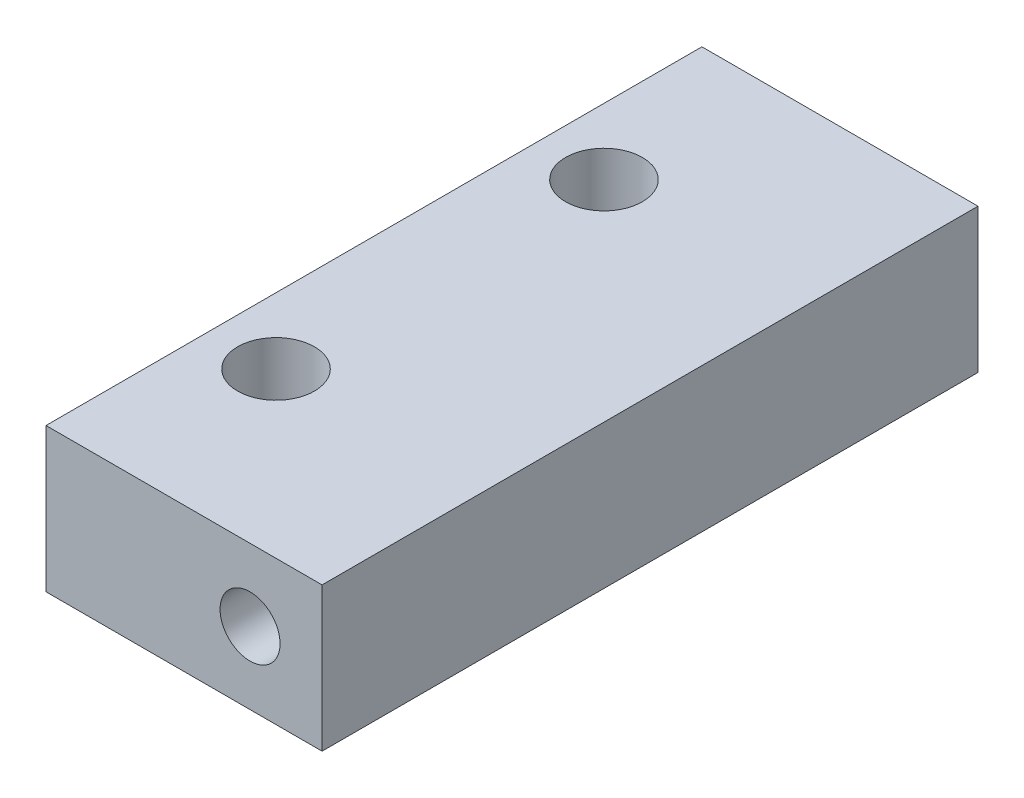
ISO-10303-21;
HEADER;
FILE_DESCRIPTION(('STEP AP214'),'2;1');
FILE_NAME('part.step','',(''),(''),'','','');
FILE_SCHEMA(('AUTOMOTIVE_DESIGN { 1 0 10303 214 1 1 1 1 }'));
ENDSEC;
DATA;
#1=APPLICATION_CONTEXT('core data for automotive mechanical design processes');
#2=APPLICATION_PROTOCOL_DEFINITION('international standard','automotive_design',2000,#1);
#3=PRODUCT_CONTEXT('',#1,'mechanical');
#4=PRODUCT('Part','Part','',(#3));
#5=PRODUCT_RELATED_PRODUCT_CATEGORY('part','',(#4));
#6=PRODUCT_DEFINITION_FORMATION('','',#4);
#7=PRODUCT_DEFINITION_CONTEXT('part definition',#1,'design');
#8=PRODUCT_DEFINITION('design','',#6,#7);
#9=PRODUCT_DEFINITION_SHAPE('','',#8);
#10=(LENGTH_UNIT() NAMED_UNIT(*) SI_UNIT(.MILLI.,.METRE.));
#11=(NAMED_UNIT(*) PLANE_ANGLE_UNIT() SI_UNIT($,.RADIAN.));
#12=(NAMED_UNIT(*) SI_UNIT($,.STERADIAN.) SOLID_ANGLE_UNIT());
#13=UNCERTAINTY_MEASURE_WITH_UNIT(LENGTH_MEASURE(1.E-05),#10,'distance_accuracy_value','');
#14=(GEOMETRIC_REPRESENTATION_CONTEXT(3) GLOBAL_UNCERTAINTY_ASSIGNED_CONTEXT((#13)) GLOBAL_UNIT_ASSIGNED_CONTEXT((#10,
#11,#12)) REPRESENTATION_CONTEXT('',''));
#15=CARTESIAN_POINT('',(0.,0.,0.));
#16=DIRECTION('',(0.,0.,1.));
#17=DIRECTION('',(1.,0.,0.));
#18=AXIS2_PLACEMENT_3D('',#15,#16,#17);
#19=CARTESIAN_POINT('',(0.,6.,0.));
#20=DIRECTION('',(-1.,0.,0.));
#21=DIRECTION('',(0.,0.,1.));
#22=AXIS2_PLACEMENT_3D('',#19,#20,#21);
#23=PLANE('',#22);
#24=DIRECTION('',(0.,0.,-1.));
#25=VECTOR('',#24,1.);
#26=CARTESIAN_POINT('',(0.,0.,0.));
#27=LINE('',#26,#25);
#28=CARTESIAN_POINT('',(0.,0.,0.));
#29=VERTEX_POINT('',#28);
#30=CARTESIAN_POINT('',(0.,0.,-27.323));
#31=VERTEX_POINT('',#30);
#32=EDGE_CURVE('E102',#29,#31,#27,.T.);
#33=ORIENTED_EDGE('',*,*,#32,.F.);
#34=DIRECTION('',(0.,-1.,0.));
#35=VECTOR('',#34,1.);
#36=CARTESIAN_POINT('',(0.,6.,0.));
#37=LINE('',#36,#35);
#38=CARTESIAN_POINT('',(0.,6.,0.));
#39=VERTEX_POINT('',#38);
#40=EDGE_CURVE('E11',#39,#29,#37,.T.);
#41=ORIENTED_EDGE('',*,*,#40,.F.);
#42=DIRECTION('',(0.,0.,-1.));
#43=VECTOR('',#42,1.);
#44=CARTESIAN_POINT('',(0.,6.,0.));
#45=LINE('',#44,#43);
#46=CARTESIAN_POINT('',(0.,6.,-27.323));
#47=VERTEX_POINT('',#46);
#48=EDGE_CURVE('E81',#39,#47,#45,.T.);
#49=ORIENTED_EDGE('',*,*,#48,.T.);
#50=DIRECTION('',(0.,-1.,0.));
#51=VECTOR('',#50,1.);
#52=CARTESIAN_POINT('',(0.,6.,-27.323));
#53=LINE('',#52,#51);
#54=EDGE_CURVE('E48',#47,#31,#53,.T.);
#55=ORIENTED_EDGE('',*,*,#54,.T.);
#56=EDGE_LOOP('',(#33,#41,#49,#55));
#57=FACE_BOUND('',#56,.T.);
#58=ADVANCED_FACE('F32',(#57),#23,.T.);
#59=CARTESIAN_POINT('',(0.,6.,0.));
#60=DIRECTION('',(0.,0.,-1.));
#61=DIRECTION('',(-1.,0.,0.));
#62=AXIS2_PLACEMENT_3D('',#59,#60,#61);
#63=PLANE('',#62);
#64=CARTESIAN_POINT('',(8.5,3.,0.));
#65=DIRECTION('',(0.,0.,1.));
#66=DIRECTION('',(1.,0.,0.));
#67=AXIS2_PLACEMENT_3D('',#64,#65,#66);
#68=CIRCLE('',#67,1.25);
#69=CARTESIAN_POINT('',(9.75,3.,0.));
#70=VERTEX_POINT('',#69);
#71=EDGE_CURVE('E121',#70,#70,#68,.T.);
#72=ORIENTED_EDGE('',*,*,#71,.F.);
#73=EDGE_LOOP('',(#72));
#74=FACE_BOUND('',#73,.T.);
#75=DIRECTION('',(1.,0.,0.));
#76=VECTOR('',#75,1.);
#77=CARTESIAN_POINT('',(0.,0.,0.));
#78=LINE('',#77,#76);
#79=CARTESIAN_POINT('',(11.5,0.,0.));
#80=VERTEX_POINT('',#79);
#81=EDGE_CURVE('E87',#29,#80,#78,.T.);
#82=ORIENTED_EDGE('',*,*,#81,.T.);
#83=DIRECTION('',(0.,-1.,0.));
#84=VECTOR('',#83,1.);
#85=CARTESIAN_POINT('',(11.5,6.,0.));
#86=LINE('',#85,#84);
#87=CARTESIAN_POINT('',(11.5,6.,0.));
#88=VERTEX_POINT('',#87);
#89=EDGE_CURVE('E40',#88,#80,#86,.T.);
#90=ORIENTED_EDGE('',*,*,#89,.F.);
#91=DIRECTION('',(1.,0.,0.));
#92=VECTOR('',#91,1.);
#93=CARTESIAN_POINT('',(0.,6.,0.));
#94=LINE('',#93,#92);
#95=EDGE_CURVE('E74',#39,#88,#94,.T.);
#96=ORIENTED_EDGE('',*,*,#95,.F.);
#97=ORIENTED_EDGE('',*,*,#40,.T.);
#98=EDGE_LOOP('',(#82,#90,#96,#97));
#99=FACE_BOUND('',#98,.T.);
#100=ADVANCED_FACE('F85',(#74,#99),#63,.F.);
#101=CARTESIAN_POINT('',(11.5,6.,0.));
#102=DIRECTION('',(-1.,0.,0.));
#103=DIRECTION('',(0.,0.,1.));
#104=AXIS2_PLACEMENT_3D('',#101,#102,#103);
#105=PLANE('',#104);
#106=DIRECTION('',(0.,0.,-1.));
#107=VECTOR('',#106,1.);
#108=CARTESIAN_POINT('',(11.5,0.,0.));
#109=LINE('',#108,#107);
#110=CARTESIAN_POINT('',(11.5,0.,-27.323));
#111=VERTEX_POINT('',#110);
#112=EDGE_CURVE('E106',#80,#111,#109,.T.);
#113=ORIENTED_EDGE('',*,*,#112,.T.);
#114=DIRECTION('',(0.,-1.,0.));
#115=VECTOR('',#114,1.);
#116=CARTESIAN_POINT('',(11.5,6.,-27.323));
#117=LINE('',#116,#115);
#118=CARTESIAN_POINT('',(11.5,6.,-27.323));
#119=VERTEX_POINT('',#118);
#120=EDGE_CURVE('E62',#119,#111,#117,.T.);
#121=ORIENTED_EDGE('',*,*,#120,.F.);
#122=DIRECTION('',(0.,0.,-1.));
#123=VECTOR('',#122,1.);
#124=CARTESIAN_POINT('',(11.5,6.,0.));
#125=LINE('',#124,#123);
#126=EDGE_CURVE('E80',#88,#119,#125,.T.);
#127=ORIENTED_EDGE('',*,*,#126,.F.);
#128=ORIENTED_EDGE('',*,*,#89,.T.);
#129=EDGE_LOOP('',(#113,#121,#127,#128));
#130=FACE_BOUND('',#129,.T.);
#131=ADVANCED_FACE('F90',(#130),#105,.F.);
#132=CARTESIAN_POINT('',(2.75,6.,-20.492));
#133=DIRECTION('',(0.,-1.,0.));
#134=DIRECTION('',(0.,0.,-1.));
#135=AXIS2_PLACEMENT_3D('',#132,#133,#134);
#136=CYLINDRICAL_SURFACE('',#135,1.6);
#137=CARTESIAN_POINT('',(2.75,6.,-20.492));
#138=DIRECTION('',(0.,1.,0.));
#139=DIRECTION('',(0.,0.,1.));
#140=AXIS2_PLACEMENT_3D('',#137,#138,#139);
#141=CIRCLE('',#140,1.6);
#142=CARTESIAN_POINT('',(2.75,6.,-18.892));
#143=VERTEX_POINT('',#142);
#144=EDGE_CURVE('E93',#143,#143,#141,.T.);
#145=ORIENTED_EDGE('',*,*,#144,.T.);
#146=EDGE_LOOP('',(#145));
#147=FACE_BOUND('',#146,.T.);
#148=CARTESIAN_POINT('',(2.75,0.,-20.492));
#149=DIRECTION('',(0.,1.,0.));
#150=DIRECTION('',(0.,0.,1.));
#151=AXIS2_PLACEMENT_3D('',#148,#149,#150);
#152=CIRCLE('',#151,1.6);
#153=CARTESIAN_POINT('',(2.75,0.,-18.892));
#154=VERTEX_POINT('',#153);
#155=EDGE_CURVE('E111',#154,#154,#152,.T.);
#156=ORIENTED_EDGE('',*,*,#155,.F.);
#157=EDGE_LOOP('',(#156));
#158=FACE_BOUND('',#157,.T.);
#159=ADVANCED_FACE('F141',(#147,#158),#136,.F.);
#160=CARTESIAN_POINT('',(0.,6.,-27.323));
#161=DIRECTION('',(0.,0.,-1.));
#162=DIRECTION('',(-1.,0.,0.));
#163=AXIS2_PLACEMENT_3D('',#160,#161,#162);
#164=PLANE('',#163);
#165=CARTESIAN_POINT('',(8.5,3.,-27.323));
#166=DIRECTION('',(0.,0.,1.));
#167=DIRECTION('',(1.,0.,0.));
#168=AXIS2_PLACEMENT_3D('',#165,#166,#167);
#169=CIRCLE('',#168,1.25);
#170=CARTESIAN_POINT('',(9.75,3.,-27.323));
#171=VERTEX_POINT('',#170);
#172=EDGE_CURVE('E104',#171,#171,#169,.T.);
#173=ORIENTED_EDGE('',*,*,#172,.T.);
#174=EDGE_LOOP('',(#173));
#175=FACE_BOUND('',#174,.T.);
#176=DIRECTION('',(1.,0.,0.));
#177=VECTOR('',#176,1.);
#178=CARTESIAN_POINT('',(0.,0.,-27.323));
#179=LINE('',#178,#177);
#180=EDGE_CURVE('E108',#31,#111,#179,.T.);
#181=ORIENTED_EDGE('',*,*,#180,.F.);
#182=ORIENTED_EDGE('',*,*,#54,.F.);
#183=DIRECTION('',(1.,0.,0.));
#184=VECTOR('',#183,1.);
#185=CARTESIAN_POINT('',(0.,6.,-27.323));
#186=LINE('',#185,#184);
#187=EDGE_CURVE('E91',#47,#119,#186,.T.);
#188=ORIENTED_EDGE('',*,*,#187,.T.);
#189=ORIENTED_EDGE('',*,*,#120,.T.);
#190=EDGE_LOOP('',(#181,#182,#188,#189));
#191=FACE_BOUND('',#190,.T.);
#192=ADVANCED_FACE('F127',(#175,#191),#164,.T.);
#193=CARTESIAN_POINT('',(2.75,6.,-6.831));
#194=DIRECTION('',(0.,-1.,0.));
#195=DIRECTION('',(0.,0.,-1.));
#196=AXIS2_PLACEMENT_3D('',#193,#194,#195);
#197=CYLINDRICAL_SURFACE('',#196,1.6);
#198=CARTESIAN_POINT('',(2.75,6.,-6.831));
#199=DIRECTION('',(0.,1.,0.));
#200=DIRECTION('',(0.,0.,1.));
#201=AXIS2_PLACEMENT_3D('',#198,#199,#200);
#202=CIRCLE('',#201,1.6);
#203=CARTESIAN_POINT('',(2.75,6.,-5.231));
#204=VERTEX_POINT('',#203);
#205=EDGE_CURVE('E99',#204,#204,#202,.T.);
#206=ORIENTED_EDGE('',*,*,#205,.T.);
#207=EDGE_LOOP('',(#206));
#208=FACE_BOUND('',#207,.T.);
#209=CARTESIAN_POINT('',(2.75,0.,-6.831));
#210=DIRECTION('',(0.,1.,0.));
#211=DIRECTION('',(0.,0.,1.));
#212=AXIS2_PLACEMENT_3D('',#209,#210,#211);
#213=CIRCLE('',#212,1.6);
#214=CARTESIAN_POINT('',(2.75,0.,-5.231));
#215=VERTEX_POINT('',#214);
#216=EDGE_CURVE('E114',#215,#215,#213,.T.);
#217=ORIENTED_EDGE('',*,*,#216,.F.);
#218=EDGE_LOOP('',(#217));
#219=FACE_BOUND('',#218,.T.);
#220=ADVANCED_FACE('F146',(#208,#219),#197,.F.);
#221=CARTESIAN_POINT('',(0.,6.,0.));
#222=DIRECTION('',(0.,1.,0.));
#223=DIRECTION('',(0.,0.,1.));
#224=AXIS2_PLACEMENT_3D('',#221,#222,#223);
#225=PLANE('',#224);
#226=ORIENTED_EDGE('',*,*,#48,.F.);
#227=ORIENTED_EDGE('',*,*,#95,.T.);
#228=ORIENTED_EDGE('',*,*,#126,.T.);
#229=ORIENTED_EDGE('',*,*,#187,.F.);
#230=EDGE_LOOP('',(#226,#227,#228,#229));
#231=FACE_BOUND('',#230,.T.);
#232=ORIENTED_EDGE('',*,*,#144,.F.);
#233=EDGE_LOOP('',(#232));
#234=FACE_BOUND('',#233,.T.);
#235=ORIENTED_EDGE('',*,*,#205,.F.);
#236=EDGE_LOOP('',(#235));
#237=FACE_BOUND('',#236,.T.);
#238=ADVANCED_FACE('F76',(#231,#234,#237),#225,.T.);
#239=CARTESIAN_POINT('',(0.,0.,0.));
#240=DIRECTION('',(0.,1.,0.));
#241=DIRECTION('',(0.,0.,1.));
#242=AXIS2_PLACEMENT_3D('',#239,#240,#241);
#243=PLANE('',#242);
#244=ORIENTED_EDGE('',*,*,#32,.T.);
#245=ORIENTED_EDGE('',*,*,#180,.T.);
#246=ORIENTED_EDGE('',*,*,#112,.F.);
#247=ORIENTED_EDGE('',*,*,#81,.F.);
#248=EDGE_LOOP('',(#244,#245,#246,#247));
#249=FACE_BOUND('',#248,.T.);
#250=ORIENTED_EDGE('',*,*,#155,.T.);
#251=EDGE_LOOP('',(#250));
#252=FACE_BOUND('',#251,.T.);
#253=ORIENTED_EDGE('',*,*,#216,.T.);
#254=EDGE_LOOP('',(#253));
#255=FACE_BOUND('',#254,.T.);
#256=ADVANCED_FACE('F132',(#249,#252,#255),#243,.F.);
#257=CARTESIAN_POINT('',(8.5,3.,-27.323));
#258=DIRECTION('',(0.,0.,1.));
#259=DIRECTION('',(1.,0.,0.));
#260=AXIS2_PLACEMENT_3D('',#257,#258,#259);
#261=CYLINDRICAL_SURFACE('',#260,1.25);
#262=ORIENTED_EDGE('',*,*,#172,.F.);
#263=EDGE_LOOP('',(#262));
#264=FACE_BOUND('',#263,.T.);
#265=ORIENTED_EDGE('',*,*,#71,.T.);
#266=EDGE_LOOP('',(#265));
#267=FACE_BOUND('',#266,.T.);
#268=ADVANCED_FACE('F129',(#264,#267),#261,.F.);
#269=CLOSED_SHELL('',(#58,#100,#131,#159,#192,#220,#238,#256,#268));
#270=MANIFOLD_SOLID_BREP('B2',#269);
#271=ADVANCED_BREP_SHAPE_REPRESENTATION('',(#18,#270),#14);
#272=SHAPE_DEFINITION_REPRESENTATION(#9,#271);
ENDSEC;
END-ISO-10303-21;
